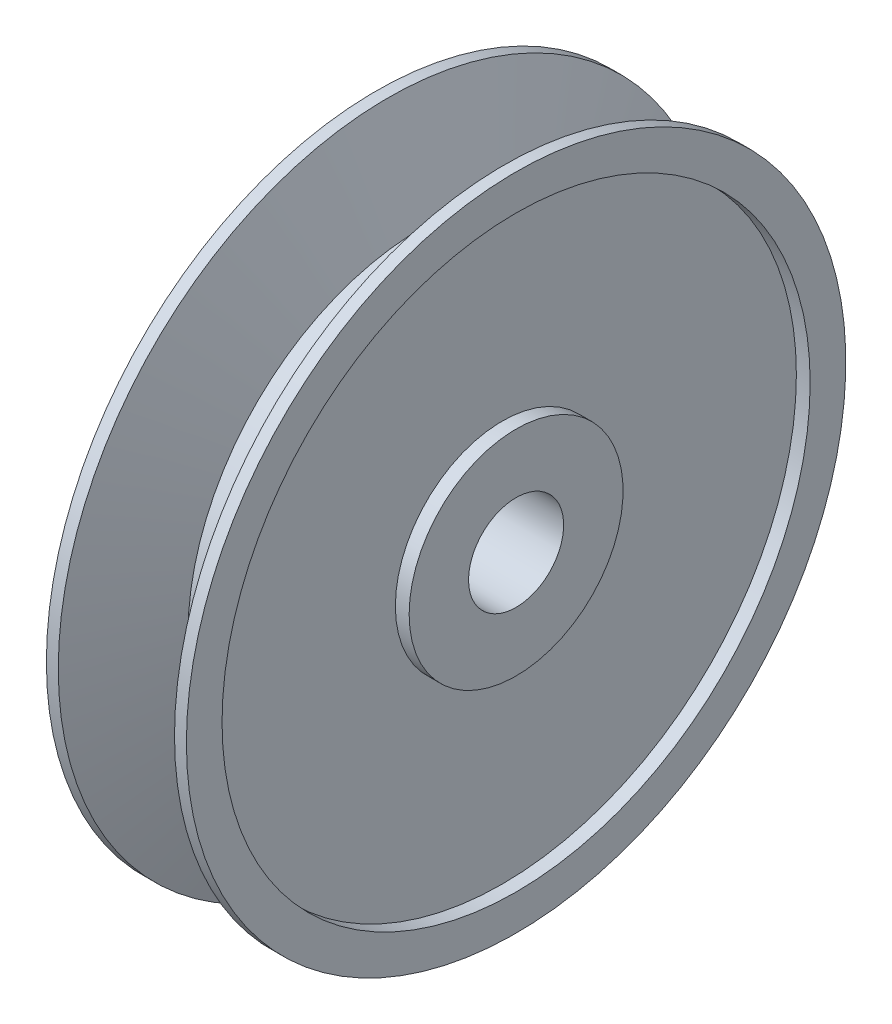
ISO-10303-21;
HEADER;
FILE_DESCRIPTION(('STEP AP214'),'2;1');
FILE_NAME('part.step','',(''),(''),'','','');
FILE_SCHEMA(('AUTOMOTIVE_DESIGN { 1 0 10303 214 1 1 1 1 }'));
ENDSEC;
DATA;
#1=APPLICATION_CONTEXT('core data for automotive mechanical design processes');
#2=APPLICATION_PROTOCOL_DEFINITION('international standard','automotive_design',2000,#1);
#3=PRODUCT_CONTEXT('',#1,'mechanical');
#4=PRODUCT('Part','Part','',(#3));
#5=PRODUCT_RELATED_PRODUCT_CATEGORY('part','',(#4));
#6=PRODUCT_DEFINITION_FORMATION('','',#4);
#7=PRODUCT_DEFINITION_CONTEXT('part definition',#1,'design');
#8=PRODUCT_DEFINITION('design','',#6,#7);
#9=PRODUCT_DEFINITION_SHAPE('','',#8);
#10=(LENGTH_UNIT() NAMED_UNIT(*) SI_UNIT(.MILLI.,.METRE.));
#11=(NAMED_UNIT(*) PLANE_ANGLE_UNIT() SI_UNIT($,.RADIAN.));
#12=(NAMED_UNIT(*) SI_UNIT($,.STERADIAN.) SOLID_ANGLE_UNIT());
#13=UNCERTAINTY_MEASURE_WITH_UNIT(LENGTH_MEASURE(1.E-05),#10,'distance_accuracy_value','');
#14=(GEOMETRIC_REPRESENTATION_CONTEXT(3) GLOBAL_UNCERTAINTY_ASSIGNED_CONTEXT((#13)) GLOBAL_UNIT_ASSIGNED_CONTEXT((#10,
#11,#12)) REPRESENTATION_CONTEXT('',''));
#15=CARTESIAN_POINT('',(0.,0.,0.));
#16=DIRECTION('',(0.,0.,1.));
#17=DIRECTION('',(1.,0.,0.));
#18=AXIS2_PLACEMENT_3D('',#15,#16,#17);
#19=CARTESIAN_POINT('',(0.,0.,0.));
#20=DIRECTION('',(1.,0.,0.));
#21=DIRECTION('',(0.,0.,1.));
#22=AXIS2_PLACEMENT_3D('',#19,#20,#21);
#23=CYLINDRICAL_SURFACE('',#22,27.74);
#24=CARTESIAN_POINT('',(-5.89000000000003,0.,0.));
#25=DIRECTION('',(-1.,0.,0.));
#26=DIRECTION('',(0.,0.,1.));
#27=AXIS2_PLACEMENT_3D('',#24,#25,#26);
#28=CIRCLE('',#27,27.74);
#29=CARTESIAN_POINT('',(-5.89000000000003,0.,27.74));
#30=VERTEX_POINT('',#29);
#31=EDGE_CURVE('E101',#30,#30,#28,.T.);
#32=ORIENTED_EDGE('',*,*,#31,.F.);
#33=EDGE_LOOP('',(#32));
#34=FACE_BOUND('',#33,.T.);
#35=CARTESIAN_POINT('',(-4.8895916965194,0.,0.));
#36=DIRECTION('',(-1.,0.,0.));
#37=DIRECTION('',(0.,0.,1.));
#38=AXIS2_PLACEMENT_3D('',#35,#36,#37);
#39=CIRCLE('',#38,27.74);
#40=CARTESIAN_POINT('',(-4.8895916965194,0.,27.74));
#41=VERTEX_POINT('',#40);
#42=EDGE_CURVE('E109',#41,#41,#39,.T.);
#43=ORIENTED_EDGE('',*,*,#42,.T.);
#44=EDGE_LOOP('',(#43));
#45=FACE_BOUND('',#44,.T.);
#46=ADVANCED_FACE('F41',(#34,#45),#23,.T.);
#47=CARTESIAN_POINT('',(0.,0.,0.));
#48=DIRECTION('',(-1.,0.,0.));
#49=DIRECTION('',(0.,0.,1.));
#50=AXIS2_PLACEMENT_3D('',#47,#48,#49);
#51=CYLINDRICAL_SURFACE('',#50,27.74);
#52=CARTESIAN_POINT('',(5.89000000000003,0.,0.));
#53=DIRECTION('',(-1.,0.,0.));
#54=DIRECTION('',(0.,0.,1.));
#55=AXIS2_PLACEMENT_3D('',#52,#53,#54);
#56=CIRCLE('',#55,27.74);
#57=CARTESIAN_POINT('',(5.89000000000003,0.,27.74));
#58=VERTEX_POINT('',#57);
#59=EDGE_CURVE('E69',#58,#58,#56,.T.);
#60=ORIENTED_EDGE('',*,*,#59,.T.);
#61=EDGE_LOOP('',(#60));
#62=FACE_BOUND('',#61,.T.);
#63=CARTESIAN_POINT('',(4.8895916965194,0.,0.));
#64=DIRECTION('',(-1.,0.,0.));
#65=DIRECTION('',(0.,0.,1.));
#66=AXIS2_PLACEMENT_3D('',#63,#64,#65);
#67=CIRCLE('',#66,27.74);
#68=CARTESIAN_POINT('',(4.8895916965194,0.,27.74));
#69=VERTEX_POINT('',#68);
#70=EDGE_CURVE('E77',#69,#69,#67,.T.);
#71=ORIENTED_EDGE('',*,*,#70,.F.);
#72=EDGE_LOOP('',(#71));
#73=FACE_BOUND('',#72,.T.);
#74=ADVANCED_FACE('F140',(#62,#73),#51,.T.);
#75=CARTESIAN_POINT('',(0.,0.,0.));
#76=DIRECTION('',(-1.,0.,0.));
#77=DIRECTION('',(0.,0.,1.));
#78=AXIS2_PLACEMENT_3D('',#75,#76,#77);
#79=CYLINDRICAL_SURFACE('',#78,4.);
#80=CARTESIAN_POINT('',(5.89,0.,0.));
#81=DIRECTION('',(-1.,0.,0.));
#82=DIRECTION('',(0.,0.,1.));
#83=AXIS2_PLACEMENT_3D('',#80,#81,#82);
#84=CIRCLE('',#83,4.);
#85=CARTESIAN_POINT('',(5.89,0.,4.));
#86=VERTEX_POINT('',#85);
#87=EDGE_CURVE('E10',#86,#86,#84,.T.);
#88=ORIENTED_EDGE('',*,*,#87,.F.);
#89=EDGE_LOOP('',(#88));
#90=FACE_BOUND('',#89,.T.);
#91=CARTESIAN_POINT('',(-5.89,0.,0.));
#92=DIRECTION('',(-1.,0.,0.));
#93=DIRECTION('',(0.,0.,1.));
#94=AXIS2_PLACEMENT_3D('',#91,#92,#93);
#95=CIRCLE('',#94,4.);
#96=CARTESIAN_POINT('',(-5.89,0.,4.));
#97=VERTEX_POINT('',#96);
#98=EDGE_CURVE('E81',#97,#97,#95,.T.);
#99=ORIENTED_EDGE('',*,*,#98,.T.);
#100=EDGE_LOOP('',(#99));
#101=FACE_BOUND('',#100,.T.);
#102=ADVANCED_FACE('F43',(#90,#101),#79,.F.);
#103=CARTESIAN_POINT('',(5.89,4.,0.));
#104=DIRECTION('',(-1.,0.,0.));
#105=DIRECTION('',(0.,0.,1.));
#106=AXIS2_PLACEMENT_3D('',#103,#104,#105);
#107=PLANE('',#106);
#108=CARTESIAN_POINT('',(5.89,0.,0.));
#109=DIRECTION('',(-1.,0.,0.));
#110=DIRECTION('',(0.,0.,1.));
#111=AXIS2_PLACEMENT_3D('',#108,#109,#110);
#112=CIRCLE('',#111,9.);
#113=CARTESIAN_POINT('',(5.89,0.,9.));
#114=VERTEX_POINT('',#113);
#115=EDGE_CURVE('E49',#114,#114,#112,.T.);
#116=ORIENTED_EDGE('',*,*,#115,.F.);
#117=EDGE_LOOP('',(#116));
#118=FACE_BOUND('',#117,.T.);
#119=ORIENTED_EDGE('',*,*,#87,.T.);
#120=EDGE_LOOP('',(#119));
#121=FACE_BOUND('',#120,.T.);
#122=ADVANCED_FACE('F173',(#118,#121),#107,.F.);
#123=CARTESIAN_POINT('',(0.,0.,0.));
#124=DIRECTION('',(-1.,0.,0.));
#125=DIRECTION('',(0.,0.,1.));
#126=AXIS2_PLACEMENT_3D('',#123,#124,#125);
#127=CYLINDRICAL_SURFACE('',#126,9.);
#128=CARTESIAN_POINT('',(4.73091144695688,0.,0.));
#129=DIRECTION('',(-1.,0.,0.));
#130=DIRECTION('',(0.,0.,1.));
#131=AXIS2_PLACEMENT_3D('',#128,#129,#130);
#132=CIRCLE('',#131,9.);
#133=CARTESIAN_POINT('',(4.73091144695688,0.,9.));
#134=VERTEX_POINT('',#133);
#135=EDGE_CURVE('E54',#134,#134,#132,.T.);
#136=ORIENTED_EDGE('',*,*,#135,.F.);
#137=EDGE_LOOP('',(#136));
#138=FACE_BOUND('',#137,.T.);
#139=ORIENTED_EDGE('',*,*,#115,.T.);
#140=EDGE_LOOP('',(#139));
#141=FACE_BOUND('',#140,.T.);
#142=ADVANCED_FACE('F178',(#138,#141),#127,.T.);
#143=CARTESIAN_POINT('',(4.73091144695688,9.,0.));
#144=DIRECTION('',(-1.,0.,0.));
#145=DIRECTION('',(0.,0.,1.));
#146=AXIS2_PLACEMENT_3D('',#143,#144,#145);
#147=PLANE('',#146);
#148=CARTESIAN_POINT('',(4.73091144695688,0.,0.));
#149=DIRECTION('',(-1.,0.,0.));
#150=DIRECTION('',(0.,0.,1.));
#151=AXIS2_PLACEMENT_3D('',#148,#149,#150);
#152=CIRCLE('',#151,24.74);
#153=CARTESIAN_POINT('',(4.73091144695688,0.,24.74));
#154=VERTEX_POINT('',#153);
#155=EDGE_CURVE('E59',#154,#154,#152,.T.);
#156=ORIENTED_EDGE('',*,*,#155,.F.);
#157=EDGE_LOOP('',(#156));
#158=FACE_BOUND('',#157,.T.);
#159=ORIENTED_EDGE('',*,*,#135,.T.);
#160=EDGE_LOOP('',(#159));
#161=FACE_BOUND('',#160,.T.);
#162=ADVANCED_FACE('F183',(#158,#161),#147,.F.);
#163=CARTESIAN_POINT('',(0.,0.,0.));
#164=DIRECTION('',(-1.,0.,0.));
#165=DIRECTION('',(0.,0.,1.));
#166=AXIS2_PLACEMENT_3D('',#163,#164,#165);
#167=CYLINDRICAL_SURFACE('',#166,24.74);
#168=CARTESIAN_POINT('',(5.89,0.,0.));
#169=DIRECTION('',(-1.,0.,0.));
#170=DIRECTION('',(0.,0.,1.));
#171=AXIS2_PLACEMENT_3D('',#168,#169,#170);
#172=CIRCLE('',#171,24.74);
#173=CARTESIAN_POINT('',(5.89,0.,24.74));
#174=VERTEX_POINT('',#173);
#175=EDGE_CURVE('E65',#174,#174,#172,.T.);
#176=ORIENTED_EDGE('',*,*,#175,.F.);
#177=EDGE_LOOP('',(#176));
#178=FACE_BOUND('',#177,.T.);
#179=ORIENTED_EDGE('',*,*,#155,.T.);
#180=EDGE_LOOP('',(#179));
#181=FACE_BOUND('',#180,.T.);
#182=ADVANCED_FACE('F135',(#178,#181),#167,.F.);
#183=CARTESIAN_POINT('',(5.89000000000001,24.74,0.));
#184=DIRECTION('',(-1.,0.,0.));
#185=DIRECTION('',(0.,0.,1.));
#186=AXIS2_PLACEMENT_3D('',#183,#184,#185);
#187=PLANE('',#186);
#188=ORIENTED_EDGE('',*,*,#59,.F.);
#189=EDGE_LOOP('',(#188));
#190=FACE_BOUND('',#189,.T.);
#191=ORIENTED_EDGE('',*,*,#175,.T.);
#192=EDGE_LOOP('',(#191));
#193=FACE_BOUND('',#192,.T.);
#194=ADVANCED_FACE('F125',(#190,#193),#187,.F.);
#195=CARTESIAN_POINT('',(0.,0.,0.));
#196=DIRECTION('',(-1.,0.,0.));
#197=DIRECTION('',(0.,0.,1.));
#198=AXIS2_PLACEMENT_3D('',#195,#196,#197);
#199=CYLINDRICAL_SURFACE('',#198,19.74);
#200=CARTESIAN_POINT('',(1.97782982238981,0.,0.));
#201=DIRECTION('',(-1.,0.,0.));
#202=DIRECTION('',(0.,0.,1.));
#203=AXIS2_PLACEMENT_3D('',#200,#201,#202);
#204=CIRCLE('',#203,19.74);
#205=CARTESIAN_POINT('',(1.97782982238981,0.,19.74));
#206=VERTEX_POINT('',#205);
#207=EDGE_CURVE('E73',#206,#206,#204,.T.);
#208=ORIENTED_EDGE('',*,*,#207,.T.);
#209=EDGE_LOOP('',(#208));
#210=FACE_BOUND('',#209,.T.);
#211=CARTESIAN_POINT('',(-1.97782982238981,0.,0.));
#212=DIRECTION('',(-1.,0.,0.));
#213=DIRECTION('',(0.,0.,1.));
#214=AXIS2_PLACEMENT_3D('',#211,#212,#213);
#215=CIRCLE('',#214,19.74);
#216=CARTESIAN_POINT('',(-1.97782982238981,0.,19.74));
#217=VERTEX_POINT('',#216);
#218=EDGE_CURVE('E105',#217,#217,#215,.T.);
#219=ORIENTED_EDGE('',*,*,#218,.F.);
#220=EDGE_LOOP('',(#219));
#221=FACE_BOUND('',#220,.T.);
#222=ADVANCED_FACE('F122',(#210,#221),#199,.T.);
#223=CARTESIAN_POINT('',(1.97782982238981,0.,0.));
#224=DIRECTION('',(1.,0.,0.));
#225=DIRECTION('',(0.,0.,-1.));
#226=AXIS2_PLACEMENT_3D('',#223,#224,#225);
#227=CONICAL_SURFACE('',#226,19.74,1.22173047639603);
#228=ORIENTED_EDGE('',*,*,#70,.T.);
#229=EDGE_LOOP('',(#228));
#230=FACE_BOUND('',#229,.T.);
#231=ORIENTED_EDGE('',*,*,#207,.F.);
#232=EDGE_LOOP('',(#231));
#233=FACE_BOUND('',#232,.T.);
#234=ADVANCED_FACE('F124',(#230,#233),#227,.T.);
#235=CARTESIAN_POINT('',(-5.89,4.,0.));
#236=DIRECTION('',(1.,0.,0.));
#237=DIRECTION('',(0.,0.,1.));
#238=AXIS2_PLACEMENT_3D('',#235,#236,#237);
#239=PLANE('',#238);
#240=CARTESIAN_POINT('',(-5.89,0.,0.));
#241=DIRECTION('',(-1.,0.,0.));
#242=DIRECTION('',(0.,0.,1.));
#243=AXIS2_PLACEMENT_3D('',#240,#241,#242);
#244=CIRCLE('',#243,9.);
#245=CARTESIAN_POINT('',(-5.89,0.,9.));
#246=VERTEX_POINT('',#245);
#247=EDGE_CURVE('E85',#246,#246,#244,.T.);
#248=ORIENTED_EDGE('',*,*,#247,.T.);
#249=EDGE_LOOP('',(#248));
#250=FACE_BOUND('',#249,.T.);
#251=ORIENTED_EDGE('',*,*,#98,.F.);
#252=EDGE_LOOP('',(#251));
#253=FACE_BOUND('',#252,.T.);
#254=ADVANCED_FACE('F132',(#250,#253),#239,.F.);
#255=CARTESIAN_POINT('',(0.,0.,0.));
#256=DIRECTION('',(1.,0.,0.));
#257=DIRECTION('',(0.,0.,1.));
#258=AXIS2_PLACEMENT_3D('',#255,#256,#257);
#259=CYLINDRICAL_SURFACE('',#258,9.);
#260=CARTESIAN_POINT('',(-4.73091144695688,0.,0.));
#261=DIRECTION('',(-1.,0.,0.));
#262=DIRECTION('',(0.,0.,1.));
#263=AXIS2_PLACEMENT_3D('',#260,#261,#262);
#264=CIRCLE('',#263,9.);
#265=CARTESIAN_POINT('',(-4.73091144695688,0.,9.));
#266=VERTEX_POINT('',#265);
#267=EDGE_CURVE('E89',#266,#266,#264,.T.);
#268=ORIENTED_EDGE('',*,*,#267,.T.);
#269=EDGE_LOOP('',(#268));
#270=FACE_BOUND('',#269,.T.);
#271=ORIENTED_EDGE('',*,*,#247,.F.);
#272=EDGE_LOOP('',(#271));
#273=FACE_BOUND('',#272,.T.);
#274=ADVANCED_FACE('F159',(#270,#273),#259,.T.);
#275=CARTESIAN_POINT('',(-4.73091144695688,9.,0.));
#276=DIRECTION('',(1.,0.,0.));
#277=DIRECTION('',(0.,0.,1.));
#278=AXIS2_PLACEMENT_3D('',#275,#276,#277);
#279=PLANE('',#278);
#280=CARTESIAN_POINT('',(-4.73091144695688,0.,0.));
#281=DIRECTION('',(-1.,0.,0.));
#282=DIRECTION('',(0.,0.,1.));
#283=AXIS2_PLACEMENT_3D('',#280,#281,#282);
#284=CIRCLE('',#283,24.74);
#285=CARTESIAN_POINT('',(-4.73091144695688,0.,24.74));
#286=VERTEX_POINT('',#285);
#287=EDGE_CURVE('E93',#286,#286,#284,.T.);
#288=ORIENTED_EDGE('',*,*,#287,.T.);
#289=EDGE_LOOP('',(#288));
#290=FACE_BOUND('',#289,.T.);
#291=ORIENTED_EDGE('',*,*,#267,.F.);
#292=EDGE_LOOP('',(#291));
#293=FACE_BOUND('',#292,.T.);
#294=ADVANCED_FACE('F155',(#290,#293),#279,.F.);
#295=CARTESIAN_POINT('',(0.,0.,0.));
#296=DIRECTION('',(1.,0.,0.));
#297=DIRECTION('',(0.,0.,1.));
#298=AXIS2_PLACEMENT_3D('',#295,#296,#297);
#299=CYLINDRICAL_SURFACE('',#298,24.74);
#300=CARTESIAN_POINT('',(-5.89,0.,0.));
#301=DIRECTION('',(-1.,0.,0.));
#302=DIRECTION('',(0.,0.,1.));
#303=AXIS2_PLACEMENT_3D('',#300,#301,#302);
#304=CIRCLE('',#303,24.74);
#305=CARTESIAN_POINT('',(-5.89,0.,24.74));
#306=VERTEX_POINT('',#305);
#307=EDGE_CURVE('E97',#306,#306,#304,.T.);
#308=ORIENTED_EDGE('',*,*,#307,.T.);
#309=EDGE_LOOP('',(#308));
#310=FACE_BOUND('',#309,.T.);
#311=ORIENTED_EDGE('',*,*,#287,.F.);
#312=EDGE_LOOP('',(#311));
#313=FACE_BOUND('',#312,.T.);
#314=ADVANCED_FACE('F151',(#310,#313),#299,.F.);
#315=CARTESIAN_POINT('',(-5.89000000000001,24.74,0.));
#316=DIRECTION('',(1.,0.,0.));
#317=DIRECTION('',(0.,0.,1.));
#318=AXIS2_PLACEMENT_3D('',#315,#316,#317);
#319=PLANE('',#318);
#320=ORIENTED_EDGE('',*,*,#31,.T.);
#321=EDGE_LOOP('',(#320));
#322=FACE_BOUND('',#321,.T.);
#323=ORIENTED_EDGE('',*,*,#307,.F.);
#324=EDGE_LOOP('',(#323));
#325=FACE_BOUND('',#324,.T.);
#326=ADVANCED_FACE('F118',(#322,#325),#319,.F.);
#327=CARTESIAN_POINT('',(-1.97782982238981,0.,0.));
#328=DIRECTION('',(-1.,0.,0.));
#329=DIRECTION('',(0.,0.,-1.));
#330=AXIS2_PLACEMENT_3D('',#327,#328,#329);
#331=CONICAL_SURFACE('',#330,19.74,1.22173047639603);
#332=ORIENTED_EDGE('',*,*,#42,.F.);
#333=EDGE_LOOP('',(#332));
#334=FACE_BOUND('',#333,.T.);
#335=ORIENTED_EDGE('',*,*,#218,.T.);
#336=EDGE_LOOP('',(#335));
#337=FACE_BOUND('',#336,.T.);
#338=ADVANCED_FACE('F115',(#334,#337),#331,.T.);
#339=CLOSED_SHELL('',(#46,#74,#102,#122,#142,#162,#182,#194,#222,#234,#254,#274,#294,#314,#326,#338));
#340=MANIFOLD_SOLID_BREP('B2',#339);
#341=ADVANCED_BREP_SHAPE_REPRESENTATION('',(#18,#340),#14);
#342=SHAPE_DEFINITION_REPRESENTATION(#9,#341);
ENDSEC;
END-ISO-10303-21;
